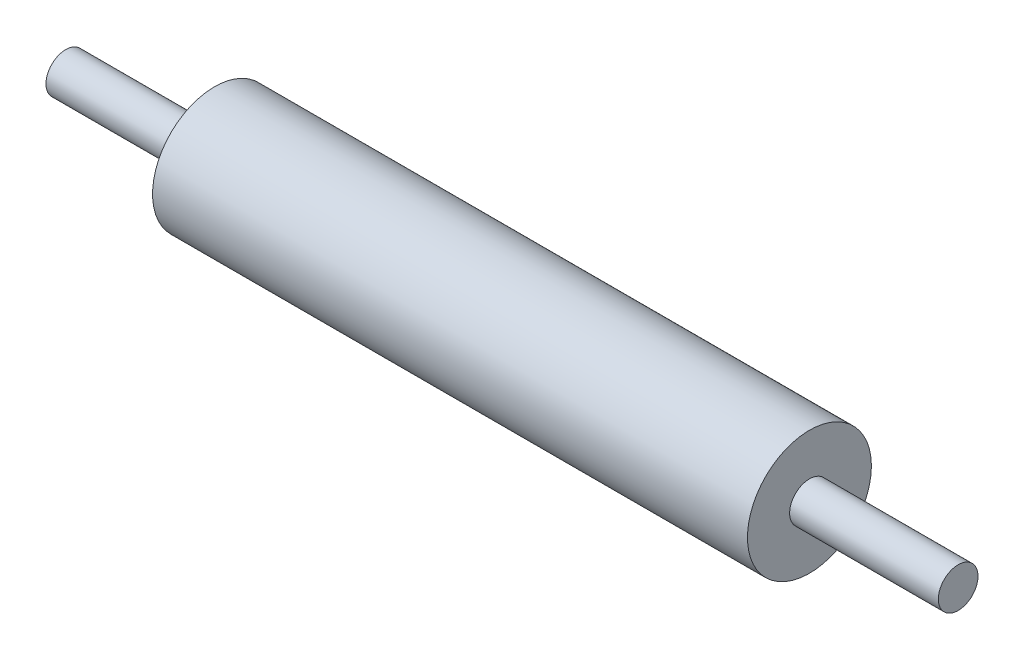
ISO-10303-21;
HEADER;
FILE_DESCRIPTION(('STEP AP214'),'2;1');
FILE_NAME('part.step','',(''),(''),'','','');
FILE_SCHEMA(('AUTOMOTIVE_DESIGN { 1 0 10303 214 1 1 1 1 }'));
ENDSEC;
DATA;
#1=APPLICATION_CONTEXT('core data for automotive mechanical design processes');
#2=APPLICATION_PROTOCOL_DEFINITION('international standard','automotive_design',2000,#1);
#3=PRODUCT_CONTEXT('',#1,'mechanical');
#4=PRODUCT('Part','Part','',(#3));
#5=PRODUCT_RELATED_PRODUCT_CATEGORY('part','',(#4));
#6=PRODUCT_DEFINITION_FORMATION('','',#4);
#7=PRODUCT_DEFINITION_CONTEXT('part definition',#1,'design');
#8=PRODUCT_DEFINITION('design','',#6,#7);
#9=PRODUCT_DEFINITION_SHAPE('','',#8);
#10=(LENGTH_UNIT() NAMED_UNIT(*) SI_UNIT(.MILLI.,.METRE.));
#11=(NAMED_UNIT(*) PLANE_ANGLE_UNIT() SI_UNIT($,.RADIAN.));
#12=(NAMED_UNIT(*) SI_UNIT($,.STERADIAN.) SOLID_ANGLE_UNIT());
#13=UNCERTAINTY_MEASURE_WITH_UNIT(LENGTH_MEASURE(1.E-05),#10,'distance_accuracy_value','');
#14=(GEOMETRIC_REPRESENTATION_CONTEXT(3) GLOBAL_UNCERTAINTY_ASSIGNED_CONTEXT((#13)) GLOBAL_UNIT_ASSIGNED_CONTEXT((#10,
#11,#12)) REPRESENTATION_CONTEXT('',''));
#15=CARTESIAN_POINT('',(0.,0.,0.));
#16=DIRECTION('',(0.,0.,1.));
#17=DIRECTION('',(1.,0.,0.));
#18=AXIS2_PLACEMENT_3D('',#15,#16,#17);
#19=CARTESIAN_POINT('',(60.,0.,0.));
#20=DIRECTION('',(-1.,0.,0.));
#21=DIRECTION('',(0.,0.,1.));
#22=AXIS2_PLACEMENT_3D('',#19,#20,#21);
#23=CYLINDRICAL_SURFACE('',#22,1.6);
#24=CARTESIAN_POINT('',(60.,0.,0.));
#25=DIRECTION('',(1.,0.,0.));
#26=DIRECTION('',(0.,0.,-1.));
#27=AXIS2_PLACEMENT_3D('',#24,#25,#26);
#28=CIRCLE('',#27,1.6);
#29=CARTESIAN_POINT('',(60.,0.,-1.6));
#30=VERTEX_POINT('',#29);
#31=EDGE_CURVE('E11',#30,#30,#28,.T.);
#32=ORIENTED_EDGE('',*,*,#31,.F.);
#33=EDGE_LOOP('',(#32));
#34=FACE_BOUND('',#33,.T.);
#35=CARTESIAN_POINT('',(48.,0.,0.));
#36=DIRECTION('',(1.,0.,0.));
#37=DIRECTION('',(0.,0.,-1.));
#38=AXIS2_PLACEMENT_3D('',#35,#36,#37);
#39=CIRCLE('',#38,1.6);
#40=CARTESIAN_POINT('',(48.,0.,-1.6));
#41=VERTEX_POINT('',#40);
#42=EDGE_CURVE('E60',#41,#41,#39,.T.);
#43=ORIENTED_EDGE('',*,*,#42,.T.);
#44=EDGE_LOOP('',(#43));
#45=FACE_BOUND('',#44,.T.);
#46=ADVANCED_FACE('F53',(#34,#45),#23,.T.);
#47=CARTESIAN_POINT('',(60.,0.,0.));
#48=DIRECTION('',(1.,0.,0.));
#49=DIRECTION('',(0.,0.,-1.));
#50=AXIS2_PLACEMENT_3D('',#47,#48,#49);
#51=PLANE('',#50);
#52=ORIENTED_EDGE('',*,*,#31,.T.);
#53=EDGE_LOOP('',(#52));
#54=FACE_BOUND('',#53,.T.);
#55=ADVANCED_FACE('F68',(#54),#51,.T.);
#56=CARTESIAN_POINT('',(48.,0.,0.));
#57=DIRECTION('',(1.,0.,0.));
#58=DIRECTION('',(0.,0.,-1.));
#59=AXIS2_PLACEMENT_3D('',#56,#57,#58);
#60=PLANE('',#59);
#61=ORIENTED_EDGE('',*,*,#42,.F.);
#62=EDGE_LOOP('',(#61));
#63=FACE_BOUND('',#62,.T.);
#64=ADVANCED_FACE('F67',(#63),#60,.F.);
#65=CLOSED_SHELL('',(#46,#55,#64));
#66=MANIFOLD_SOLID_BREP('B2',#65);
#67=CARTESIAN_POINT('',(0.,0.,0.));
#68=DIRECTION('',(-1.,0.,0.));
#69=DIRECTION('',(0.,0.,1.));
#70=AXIS2_PLACEMENT_3D('',#67,#68,#69);
#71=CYLINDRICAL_SURFACE('',#70,1.6);
#72=CARTESIAN_POINT('',(0.,0.,0.));
#73=DIRECTION('',(1.,0.,0.));
#74=DIRECTION('',(0.,0.,-1.));
#75=AXIS2_PLACEMENT_3D('',#72,#73,#74);
#76=CIRCLE('',#75,1.6);
#77=CARTESIAN_POINT('',(0.,0.,-1.6));
#78=VERTEX_POINT('',#77);
#79=EDGE_CURVE('E52',#78,#78,#76,.T.);
#80=ORIENTED_EDGE('',*,*,#79,.F.);
#81=EDGE_LOOP('',(#80));
#82=FACE_BOUND('',#81,.T.);
#83=CARTESIAN_POINT('',(-12.,0.,0.));
#84=DIRECTION('',(1.,0.,0.));
#85=DIRECTION('',(0.,0.,-1.));
#86=AXIS2_PLACEMENT_3D('',#83,#84,#85);
#87=CIRCLE('',#86,1.6);
#88=CARTESIAN_POINT('',(-12.,0.,-1.6));
#89=VERTEX_POINT('',#88);
#90=EDGE_CURVE('E120',#89,#89,#87,.T.);
#91=ORIENTED_EDGE('',*,*,#90,.T.);
#92=EDGE_LOOP('',(#91));
#93=FACE_BOUND('',#92,.T.);
#94=ADVANCED_FACE('F111',(#82,#93),#71,.T.);
#95=CARTESIAN_POINT('',(0.,0.,0.));
#96=DIRECTION('',(1.,0.,0.));
#97=DIRECTION('',(0.,0.,-1.));
#98=AXIS2_PLACEMENT_3D('',#95,#96,#97);
#99=PLANE('',#98);
#100=ORIENTED_EDGE('',*,*,#79,.T.);
#101=EDGE_LOOP('',(#100));
#102=FACE_BOUND('',#101,.T.);
#103=ADVANCED_FACE('F129',(#102),#99,.T.);
#104=CARTESIAN_POINT('',(-12.,0.,0.));
#105=DIRECTION('',(1.,0.,0.));
#106=DIRECTION('',(0.,0.,-1.));
#107=AXIS2_PLACEMENT_3D('',#104,#105,#106);
#108=PLANE('',#107);
#109=ORIENTED_EDGE('',*,*,#90,.F.);
#110=EDGE_LOOP('',(#109));
#111=FACE_BOUND('',#110,.T.);
#112=ADVANCED_FACE('F130',(#111),#108,.F.);
#113=CLOSED_SHELL('',(#94,#103,#112));
#114=MANIFOLD_SOLID_BREP('B6',#113);
#115=CARTESIAN_POINT('',(48.,0.,0.));
#116=DIRECTION('',(-1.,0.,0.));
#117=DIRECTION('',(0.,0.,1.));
#118=AXIS2_PLACEMENT_3D('',#115,#116,#117);
#119=CYLINDRICAL_SURFACE('',#118,5.);
#120=CARTESIAN_POINT('',(48.,0.,0.));
#121=DIRECTION('',(1.,0.,0.));
#122=DIRECTION('',(0.,0.,-1.));
#123=AXIS2_PLACEMENT_3D('',#120,#121,#122);
#124=CIRCLE('',#123,5.);
#125=CARTESIAN_POINT('',(48.,0.,-5.));
#126=VERTEX_POINT('',#125);
#127=EDGE_CURVE('E114',#126,#126,#124,.T.);
#128=ORIENTED_EDGE('',*,*,#127,.F.);
#129=EDGE_LOOP('',(#128));
#130=FACE_BOUND('',#129,.T.);
#131=CARTESIAN_POINT('',(0.,0.,0.));
#132=DIRECTION('',(1.,0.,0.));
#133=DIRECTION('',(0.,0.,-1.));
#134=AXIS2_PLACEMENT_3D('',#131,#132,#133);
#135=CIRCLE('',#134,5.);
#136=CARTESIAN_POINT('',(0.,0.,-5.));
#137=VERTEX_POINT('',#136);
#138=EDGE_CURVE('E168',#137,#137,#135,.T.);
#139=ORIENTED_EDGE('',*,*,#138,.T.);
#140=EDGE_LOOP('',(#139));
#141=FACE_BOUND('',#140,.T.);
#142=ADVANCED_FACE('F170',(#130,#141),#119,.T.);
#143=CARTESIAN_POINT('',(48.,0.,0.));
#144=DIRECTION('',(1.,0.,0.));
#145=DIRECTION('',(0.,0.,-1.));
#146=AXIS2_PLACEMENT_3D('',#143,#144,#145);
#147=PLANE('',#146);
#148=ORIENTED_EDGE('',*,*,#127,.T.);
#149=EDGE_LOOP('',(#148));
#150=FACE_BOUND('',#149,.T.);
#151=ADVANCED_FACE('F185',(#150),#147,.T.);
#152=CARTESIAN_POINT('',(0.,0.,0.));
#153=DIRECTION('',(1.,0.,0.));
#154=DIRECTION('',(0.,0.,-1.));
#155=AXIS2_PLACEMENT_3D('',#152,#153,#154);
#156=PLANE('',#155);
#157=ORIENTED_EDGE('',*,*,#138,.F.);
#158=EDGE_LOOP('',(#157));
#159=FACE_BOUND('',#158,.T.);
#160=ADVANCED_FACE('F180',(#159),#156,.F.);
#161=CLOSED_SHELL('',(#142,#151,#160));
#162=MANIFOLD_SOLID_BREP('B48',#161);
#163=ADVANCED_BREP_SHAPE_REPRESENTATION('',(#18,#66,#114,#162),#14);
#164=SHAPE_DEFINITION_REPRESENTATION(#9,#163);
ENDSEC;
END-ISO-10303-21;
